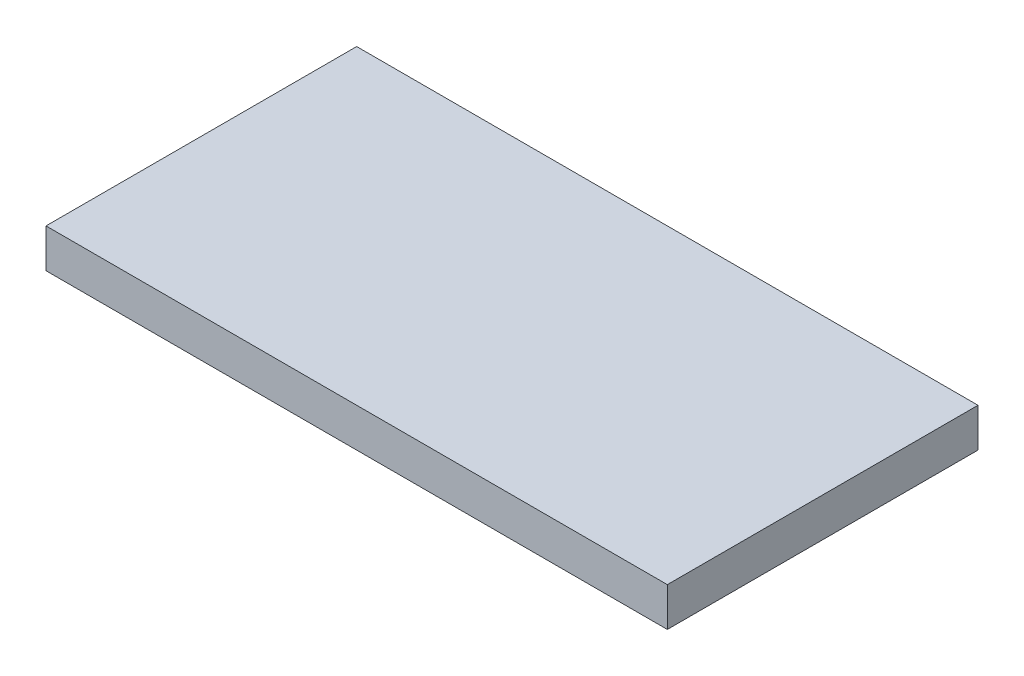
ISO-10303-21;
HEADER;
FILE_DESCRIPTION(('STEP AP214'),'2;1');
FILE_NAME('part.step','',(''),(''),'','','');
FILE_SCHEMA(('AUTOMOTIVE_DESIGN { 1 0 10303 214 1 1 1 1 }'));
ENDSEC;
DATA;
#1=APPLICATION_CONTEXT('core data for automotive mechanical design processes');
#2=APPLICATION_PROTOCOL_DEFINITION('international standard','automotive_design',2000,#1);
#3=PRODUCT_CONTEXT('',#1,'mechanical');
#4=PRODUCT('Part','Part','',(#3));
#5=PRODUCT_RELATED_PRODUCT_CATEGORY('part','',(#4));
#6=PRODUCT_DEFINITION_FORMATION('','',#4);
#7=PRODUCT_DEFINITION_CONTEXT('part definition',#1,'design');
#8=PRODUCT_DEFINITION('design','',#6,#7);
#9=PRODUCT_DEFINITION_SHAPE('','',#8);
#10=(LENGTH_UNIT() NAMED_UNIT(*) SI_UNIT(.MILLI.,.METRE.));
#11=(NAMED_UNIT(*) PLANE_ANGLE_UNIT() SI_UNIT($,.RADIAN.));
#12=(NAMED_UNIT(*) SI_UNIT($,.STERADIAN.) SOLID_ANGLE_UNIT());
#13=UNCERTAINTY_MEASURE_WITH_UNIT(LENGTH_MEASURE(1.E-05),#10,'distance_accuracy_value','');
#14=(GEOMETRIC_REPRESENTATION_CONTEXT(3) GLOBAL_UNCERTAINTY_ASSIGNED_CONTEXT((#13)) GLOBAL_UNIT_ASSIGNED_CONTEXT((#10,
#11,#12)) REPRESENTATION_CONTEXT('',''));
#15=CARTESIAN_POINT('',(0.,0.,0.));
#16=DIRECTION('',(0.,0.,1.));
#17=DIRECTION('',(1.,0.,0.));
#18=AXIS2_PLACEMENT_3D('',#15,#16,#17);
#19=CARTESIAN_POINT('',(80.,10.,40.));
#20=DIRECTION('',(-1.,0.,0.));
#21=DIRECTION('',(0.,0.,1.));
#22=AXIS2_PLACEMENT_3D('',#19,#20,#21);
#23=PLANE('',#22);
#24=DIRECTION('',(0.,0.,-1.));
#25=VECTOR('',#24,1.);
#26=CARTESIAN_POINT('',(80.,0.,40.));
#27=LINE('',#26,#25);
#28=CARTESIAN_POINT('',(80.,0.,40.));
#29=VERTEX_POINT('',#28);
#30=CARTESIAN_POINT('',(80.,0.,-40.));
#31=VERTEX_POINT('',#30);
#32=EDGE_CURVE('E99',#29,#31,#27,.T.);
#33=ORIENTED_EDGE('',*,*,#32,.T.);
#34=DIRECTION('',(0.,-1.,0.));
#35=VECTOR('',#34,1.);
#36=CARTESIAN_POINT('',(80.,10.,-40.));
#37=LINE('',#36,#35);
#38=CARTESIAN_POINT('',(80.,10.,-40.));
#39=VERTEX_POINT('',#38);
#40=EDGE_CURVE('E11',#39,#31,#37,.T.);
#41=ORIENTED_EDGE('',*,*,#40,.F.);
#42=DIRECTION('',(0.,0.,-1.));
#43=VECTOR('',#42,1.);
#44=CARTESIAN_POINT('',(80.,10.,40.));
#45=LINE('',#44,#43);
#46=CARTESIAN_POINT('',(80.,10.,40.));
#47=VERTEX_POINT('',#46);
#48=EDGE_CURVE('E87',#47,#39,#45,.T.);
#49=ORIENTED_EDGE('',*,*,#48,.F.);
#50=DIRECTION('',(0.,-1.,0.));
#51=VECTOR('',#50,1.);
#52=CARTESIAN_POINT('',(80.,10.,40.));
#53=LINE('',#52,#51);
#54=EDGE_CURVE('E95',#47,#29,#53,.T.);
#55=ORIENTED_EDGE('',*,*,#54,.T.);
#56=EDGE_LOOP('',(#33,#41,#49,#55));
#57=FACE_BOUND('',#56,.T.);
#58=ADVANCED_FACE('F36',(#57),#23,.F.);
#59=CARTESIAN_POINT('',(-80.,10.,-40.));
#60=DIRECTION('',(0.,0.,1.));
#61=DIRECTION('',(1.,0.,0.));
#62=AXIS2_PLACEMENT_3D('',#59,#60,#61);
#63=PLANE('',#62);
#64=DIRECTION('',(-1.,0.,0.));
#65=VECTOR('',#64,1.);
#66=CARTESIAN_POINT('',(-80.,0.,-40.));
#67=LINE('',#66,#65);
#68=CARTESIAN_POINT('',(-80.,0.,-40.));
#69=VERTEX_POINT('',#68);
#70=EDGE_CURVE('E91',#31,#69,#67,.T.);
#71=ORIENTED_EDGE('',*,*,#70,.T.);
#72=DIRECTION('',(0.,-1.,0.));
#73=VECTOR('',#72,1.);
#74=CARTESIAN_POINT('',(-80.,10.,-40.));
#75=LINE('',#74,#73);
#76=CARTESIAN_POINT('',(-80.,10.,-40.));
#77=VERTEX_POINT('',#76);
#78=EDGE_CURVE('E44',#77,#69,#75,.T.);
#79=ORIENTED_EDGE('',*,*,#78,.F.);
#80=DIRECTION('',(-1.,0.,0.));
#81=VECTOR('',#80,1.);
#82=CARTESIAN_POINT('',(-80.,10.,-40.));
#83=LINE('',#82,#81);
#84=EDGE_CURVE('E82',#39,#77,#83,.T.);
#85=ORIENTED_EDGE('',*,*,#84,.F.);
#86=ORIENTED_EDGE('',*,*,#40,.T.);
#87=EDGE_LOOP('',(#71,#79,#85,#86));
#88=FACE_BOUND('',#87,.T.);
#89=ADVANCED_FACE('F90',(#88),#63,.F.);
#90=CARTESIAN_POINT('',(-80.,10.,40.));
#91=DIRECTION('',(1.,0.,0.));
#92=DIRECTION('',(0.,0.,-1.));
#93=AXIS2_PLACEMENT_3D('',#90,#91,#92);
#94=PLANE('',#93);
#95=DIRECTION('',(0.,0.,1.));
#96=VECTOR('',#95,1.);
#97=CARTESIAN_POINT('',(-80.,0.,40.));
#98=LINE('',#97,#96);
#99=CARTESIAN_POINT('',(-80.,0.,40.));
#100=VERTEX_POINT('',#99);
#101=EDGE_CURVE('E69',#69,#100,#98,.T.);
#102=ORIENTED_EDGE('',*,*,#101,.T.);
#103=DIRECTION('',(0.,-1.,0.));
#104=VECTOR('',#103,1.);
#105=CARTESIAN_POINT('',(-80.,10.,40.));
#106=LINE('',#105,#104);
#107=CARTESIAN_POINT('',(-80.,10.,40.));
#108=VERTEX_POINT('',#107);
#109=EDGE_CURVE('E92',#108,#100,#106,.T.);
#110=ORIENTED_EDGE('',*,*,#109,.F.);
#111=DIRECTION('',(0.,0.,1.));
#112=VECTOR('',#111,1.);
#113=CARTESIAN_POINT('',(-80.,10.,40.));
#114=LINE('',#113,#112);
#115=EDGE_CURVE('E85',#77,#108,#114,.T.);
#116=ORIENTED_EDGE('',*,*,#115,.F.);
#117=ORIENTED_EDGE('',*,*,#78,.T.);
#118=EDGE_LOOP('',(#102,#110,#116,#117));
#119=FACE_BOUND('',#118,.T.);
#120=ADVANCED_FACE('F93',(#119),#94,.F.);
#121=CARTESIAN_POINT('',(-80.,10.,40.));
#122=DIRECTION('',(0.,0.,-1.));
#123=DIRECTION('',(-1.,0.,0.));
#124=AXIS2_PLACEMENT_3D('',#121,#122,#123);
#125=PLANE('',#124);
#126=DIRECTION('',(1.,0.,0.));
#127=VECTOR('',#126,1.);
#128=CARTESIAN_POINT('',(-80.,0.,40.));
#129=LINE('',#128,#127);
#130=EDGE_CURVE('E75',#100,#29,#129,.T.);
#131=ORIENTED_EDGE('',*,*,#130,.T.);
#132=ORIENTED_EDGE('',*,*,#54,.F.);
#133=DIRECTION('',(1.,0.,0.));
#134=VECTOR('',#133,1.);
#135=CARTESIAN_POINT('',(-80.,10.,40.));
#136=LINE('',#135,#134);
#137=EDGE_CURVE('E52',#108,#47,#136,.T.);
#138=ORIENTED_EDGE('',*,*,#137,.F.);
#139=ORIENTED_EDGE('',*,*,#109,.T.);
#140=EDGE_LOOP('',(#131,#132,#138,#139));
#141=FACE_BOUND('',#140,.T.);
#142=ADVANCED_FACE('F106',(#141),#125,.F.);
#143=CARTESIAN_POINT('',(0.,10.,0.));
#144=DIRECTION('',(0.,-1.,0.));
#145=DIRECTION('',(0.,0.,-1.));
#146=AXIS2_PLACEMENT_3D('',#143,#144,#145);
#147=PLANE('',#146);
#148=ORIENTED_EDGE('',*,*,#48,.T.);
#149=ORIENTED_EDGE('',*,*,#84,.T.);
#150=ORIENTED_EDGE('',*,*,#115,.T.);
#151=ORIENTED_EDGE('',*,*,#137,.T.);
#152=EDGE_LOOP('',(#148,#149,#150,#151));
#153=FACE_BOUND('',#152,.T.);
#154=ADVANCED_FACE('F83',(#153),#147,.F.);
#155=CARTESIAN_POINT('',(0.,0.,0.));
#156=DIRECTION('',(0.,-1.,0.));
#157=DIRECTION('',(0.,0.,-1.));
#158=AXIS2_PLACEMENT_3D('',#155,#156,#157);
#159=PLANE('',#158);
#160=ORIENTED_EDGE('',*,*,#32,.F.);
#161=ORIENTED_EDGE('',*,*,#130,.F.);
#162=ORIENTED_EDGE('',*,*,#101,.F.);
#163=ORIENTED_EDGE('',*,*,#70,.F.);
#164=EDGE_LOOP('',(#160,#161,#162,#163));
#165=FACE_BOUND('',#164,.T.);
#166=ADVANCED_FACE('F109',(#165),#159,.T.);
#167=CLOSED_SHELL('',(#58,#89,#120,#142,#154,#166));
#168=MANIFOLD_SOLID_BREP('B2',#167);
#169=ADVANCED_BREP_SHAPE_REPRESENTATION('',(#18,#168),#14);
#170=SHAPE_DEFINITION_REPRESENTATION(#9,#169);
ENDSEC;
END-ISO-10303-21;
